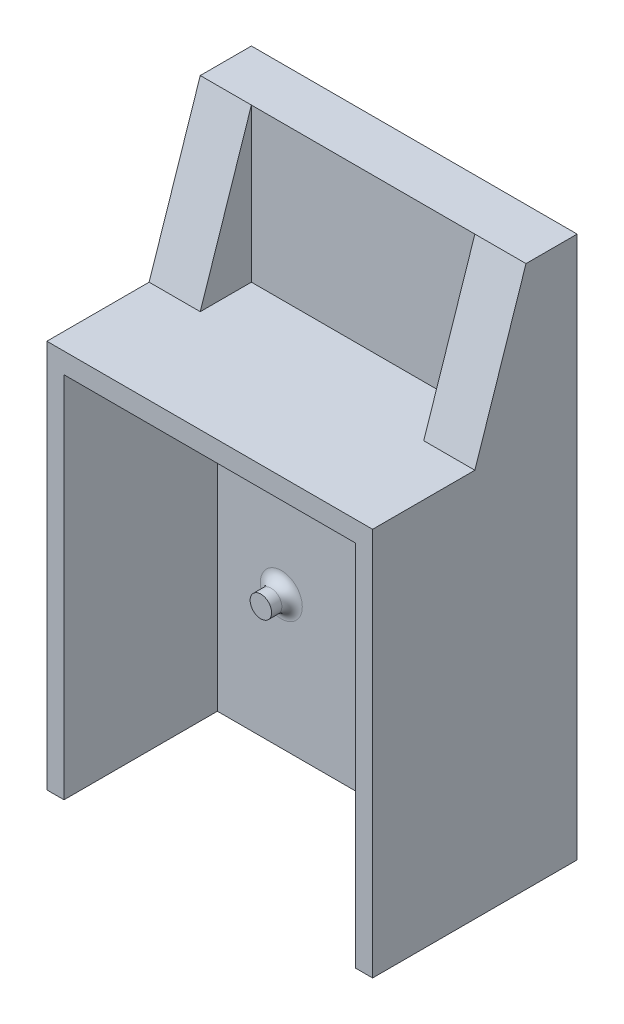
ISO-10303-21;
HEADER;
FILE_DESCRIPTION(('STEP AP214'),'2;1');
FILE_NAME('part.step','',(''),(''),'','','');
FILE_SCHEMA(('AUTOMOTIVE_DESIGN { 1 0 10303 214 1 1 1 1 }'));
ENDSEC;
DATA;
#1=APPLICATION_CONTEXT('core data for automotive mechanical design processes');
#2=APPLICATION_PROTOCOL_DEFINITION('international standard','automotive_design',2000,#1);
#3=PRODUCT_CONTEXT('',#1,'mechanical');
#4=PRODUCT('Part','Part','',(#3));
#5=PRODUCT_RELATED_PRODUCT_CATEGORY('part','',(#4));
#6=PRODUCT_DEFINITION_FORMATION('','',#4);
#7=PRODUCT_DEFINITION_CONTEXT('part definition',#1,'design');
#8=PRODUCT_DEFINITION('design','',#6,#7);
#9=PRODUCT_DEFINITION_SHAPE('','',#8);
#10=(LENGTH_UNIT() NAMED_UNIT(*) SI_UNIT(.MILLI.,.METRE.));
#11=(NAMED_UNIT(*) PLANE_ANGLE_UNIT() SI_UNIT($,.RADIAN.));
#12=(NAMED_UNIT(*) SI_UNIT($,.STERADIAN.) SOLID_ANGLE_UNIT());
#13=UNCERTAINTY_MEASURE_WITH_UNIT(LENGTH_MEASURE(1.E-05),#10,'distance_accuracy_value','');
#14=(GEOMETRIC_REPRESENTATION_CONTEXT(3) GLOBAL_UNCERTAINTY_ASSIGNED_CONTEXT((#13)) GLOBAL_UNIT_ASSIGNED_CONTEXT((#10,
#11,#12)) REPRESENTATION_CONTEXT('',''));
#15=CARTESIAN_POINT('',(0.,0.,0.));
#16=DIRECTION('',(0.,0.,1.));
#17=DIRECTION('',(1.,0.,0.));
#18=AXIS2_PLACEMENT_3D('',#15,#16,#17);
#19=CARTESIAN_POINT('',(0.,0.,5.));
#20=DIRECTION('',(0.,0.,-1.));
#21=DIRECTION('',(-1.,0.,0.));
#22=AXIS2_PLACEMENT_3D('',#19,#20,#21);
#23=PLANE('',#22);
#24=DIRECTION('',(0.,1.,0.));
#25=VECTOR('',#24,1.);
#26=CARTESIAN_POINT('',(10.9264705882353,19.,5.));
#27=LINE('',#26,#25);
#28=CARTESIAN_POINT('',(10.9264705882353,19.,5.));
#29=VERTEX_POINT('',#28);
#30=CARTESIAN_POINT('',(10.9264705882353,34.,5.));
#31=VERTEX_POINT('',#30);
#32=EDGE_CURVE('E151',#29,#31,#27,.T.);
#33=ORIENTED_EDGE('',*,*,#32,.T.);
#34=DIRECTION('',(-1.,0.,0.));
#35=VECTOR('',#34,1.);
#36=CARTESIAN_POINT('',(0.,34.,5.));
#37=LINE('',#36,#35);
#38=CARTESIAN_POINT('',(-10.9264705882353,34.,5.));
#39=VERTEX_POINT('',#38);
#40=EDGE_CURVE('E134',#31,#39,#37,.T.);
#41=ORIENTED_EDGE('',*,*,#40,.T.);
#42=DIRECTION('',(0.,-1.,0.));
#43=VECTOR('',#42,1.);
#44=CARTESIAN_POINT('',(-10.9264705882353,19.,5.));
#45=LINE('',#44,#43);
#46=CARTESIAN_POINT('',(-10.9264705882353,19.,5.));
#47=VERTEX_POINT('',#46);
#48=EDGE_CURVE('E169',#39,#47,#45,.T.);
#49=ORIENTED_EDGE('',*,*,#48,.T.);
#50=DIRECTION('',(1.,0.,0.));
#51=VECTOR('',#50,1.);
#52=CARTESIAN_POINT('',(0.,19.,5.));
#53=LINE('',#52,#51);
#54=EDGE_CURVE('E148',#47,#29,#53,.T.);
#55=ORIENTED_EDGE('',*,*,#54,.T.);
#56=EDGE_LOOP('',(#33,#41,#49,#55));
#57=FACE_BOUND('',#56,.T.);
#58=ADVANCED_FACE('F40',(#57),#23,.F.);
#59=CARTESIAN_POINT('',(0.,0.,5.));
#60=DIRECTION('',(0.,0.,1.));
#61=DIRECTION('',(1.,0.,0.));
#62=AXIS2_PLACEMENT_3D('',#59,#60,#61);
#63=PLANE('',#62);
#64=CARTESIAN_POINT('',(8.,-6.,5.));
#65=DIRECTION('',(0.,0.,1.));
#66=DIRECTION('',(1.,0.,0.));
#67=AXIS2_PLACEMENT_3D('',#64,#65,#66);
#68=CIRCLE('',#67,2.05);
#69=CARTESIAN_POINT('',(10.05,-6.,5.));
#70=VERTEX_POINT('',#69);
#71=EDGE_CURVE('E271',#70,#70,#68,.F.);
#72=ORIENTED_EDGE('',*,*,#71,.T.);
#73=EDGE_LOOP('',(#72));
#74=FACE_BOUND('',#73,.T.);
#75=CARTESIAN_POINT('',(8.,6.,5.));
#76=DIRECTION('',(0.,0.,1.));
#77=DIRECTION('',(1.,0.,0.));
#78=AXIS2_PLACEMENT_3D('',#75,#76,#77);
#79=CIRCLE('',#78,2.05);
#80=CARTESIAN_POINT('',(10.05,6.,5.));
#81=VERTEX_POINT('',#80);
#82=EDGE_CURVE('E268',#81,#81,#79,.F.);
#83=ORIENTED_EDGE('',*,*,#82,.T.);
#84=EDGE_LOOP('',(#83));
#85=FACE_BOUND('',#84,.T.);
#86=CARTESIAN_POINT('',(-8.,6.,5.));
#87=DIRECTION('',(0.,0.,1.));
#88=DIRECTION('',(1.,0.,0.));
#89=AXIS2_PLACEMENT_3D('',#86,#87,#88);
#90=CIRCLE('',#89,2.05);
#91=CARTESIAN_POINT('',(-5.95,6.,5.));
#92=VERTEX_POINT('',#91);
#93=EDGE_CURVE('E265',#92,#92,#90,.F.);
#94=ORIENTED_EDGE('',*,*,#93,.T.);
#95=EDGE_LOOP('',(#94));
#96=FACE_BOUND('',#95,.T.);
#97=CARTESIAN_POINT('',(-8.,-6.,5.));
#98=DIRECTION('',(0.,0.,1.));
#99=DIRECTION('',(1.,0.,0.));
#100=AXIS2_PLACEMENT_3D('',#97,#98,#99);
#101=CIRCLE('',#100,2.05);
#102=CARTESIAN_POINT('',(-5.95,-6.,5.));
#103=VERTEX_POINT('',#102);
#104=EDGE_CURVE('E262',#103,#103,#101,.F.);
#105=ORIENTED_EDGE('',*,*,#104,.T.);
#106=EDGE_LOOP('',(#105));
#107=FACE_BOUND('',#106,.T.);
#108=DIRECTION('',(1.,0.,0.));
#109=VECTOR('',#108,1.);
#110=CARTESIAN_POINT('',(0.,-19.,5.));
#111=LINE('',#110,#109);
#112=CARTESIAN_POINT('',(-14.25,-19.,5.));
#113=VERTEX_POINT('',#112);
#114=CARTESIAN_POINT('',(14.25,-19.,5.));
#115=VERTEX_POINT('',#114);
#116=EDGE_CURVE('E240',#113,#115,#111,.T.);
#117=ORIENTED_EDGE('',*,*,#116,.T.);
#118=DIRECTION('',(0.,1.,0.));
#119=VECTOR('',#118,1.);
#120=CARTESIAN_POINT('',(14.25,0.,5.));
#121=LINE('',#120,#119);
#122=CARTESIAN_POINT('',(14.25,17.,5.));
#123=VERTEX_POINT('',#122);
#124=EDGE_CURVE('E201',#115,#123,#121,.T.);
#125=ORIENTED_EDGE('',*,*,#124,.T.);
#126=DIRECTION('',(1.,0.,0.));
#127=VECTOR('',#126,1.);
#128=CARTESIAN_POINT('',(0.,17.,5.));
#129=LINE('',#128,#127);
#130=CARTESIAN_POINT('',(-14.25,17.,5.));
#131=VERTEX_POINT('',#130);
#132=EDGE_CURVE('E206',#131,#123,#129,.T.);
#133=ORIENTED_EDGE('',*,*,#132,.F.);
#134=DIRECTION('',(0.,-1.,0.));
#135=VECTOR('',#134,1.);
#136=CARTESIAN_POINT('',(-14.25,0.,5.));
#137=LINE('',#136,#135);
#138=EDGE_CURVE('E227',#131,#113,#137,.T.);
#139=ORIENTED_EDGE('',*,*,#138,.T.);
#140=EDGE_LOOP('',(#117,#125,#133,#139));
#141=FACE_BOUND('',#140,.T.);
#142=ADVANCED_FACE('F296',(#74,#85,#96,#107,#141),#63,.T.);
#143=CARTESIAN_POINT('',(0.,-19.,5.));
#144=DIRECTION('',(0.,1.,0.));
#145=DIRECTION('',(-1.,0.,0.));
#146=AXIS2_PLACEMENT_3D('',#143,#144,#145);
#147=PLANE('',#146);
#148=DIRECTION('',(1.,0.,0.));
#149=VECTOR('',#148,1.);
#150=CARTESIAN_POINT('',(0.,-19.,0.));
#151=LINE('',#150,#149);
#152=CARTESIAN_POINT('',(-15.9264705882353,-19.,0.));
#153=VERTEX_POINT('',#152);
#154=CARTESIAN_POINT('',(15.9264705882353,-19.,0.));
#155=VERTEX_POINT('',#154);
#156=EDGE_CURVE('E239',#153,#155,#151,.T.);
#157=ORIENTED_EDGE('',*,*,#156,.T.);
#158=DIRECTION('',(0.,0.,-1.));
#159=VECTOR('',#158,1.);
#160=CARTESIAN_POINT('',(15.9264705882353,-19.,5.));
#161=LINE('',#160,#159);
#162=CARTESIAN_POINT('',(15.9264705882353,-19.,20.));
#163=VERTEX_POINT('',#162);
#164=EDGE_CURVE('E256',#163,#155,#161,.T.);
#165=ORIENTED_EDGE('',*,*,#164,.F.);
#166=DIRECTION('',(1.,0.,0.));
#167=VECTOR('',#166,1.);
#168=CARTESIAN_POINT('',(0.,-19.,20.));
#169=LINE('',#168,#167);
#170=CARTESIAN_POINT('',(14.25,-19.,20.));
#171=VERTEX_POINT('',#170);
#172=EDGE_CURVE('E205',#171,#163,#169,.T.);
#173=ORIENTED_EDGE('',*,*,#172,.F.);
#174=DIRECTION('',(0.,0.,-1.));
#175=VECTOR('',#174,1.);
#176=CARTESIAN_POINT('',(14.25,-19.,20.));
#177=LINE('',#176,#175);
#178=EDGE_CURVE('E237',#171,#115,#177,.T.);
#179=ORIENTED_EDGE('',*,*,#178,.T.);
#180=ORIENTED_EDGE('',*,*,#116,.F.);
#181=DIRECTION('',(0.,0.,-1.));
#182=VECTOR('',#181,1.);
#183=CARTESIAN_POINT('',(-14.25,-19.,20.));
#184=LINE('',#183,#182);
#185=CARTESIAN_POINT('',(-14.25,-19.,20.));
#186=VERTEX_POINT('',#185);
#187=EDGE_CURVE('E235',#186,#113,#184,.T.);
#188=ORIENTED_EDGE('',*,*,#187,.F.);
#189=CARTESIAN_POINT('',(-15.9264705882353,-19.,20.));
#190=VERTEX_POINT('',#189);
#191=EDGE_CURVE('E210',#190,#186,#169,.T.);
#192=ORIENTED_EDGE('',*,*,#191,.F.);
#193=DIRECTION('',(0.,0.,-1.));
#194=VECTOR('',#193,1.);
#195=CARTESIAN_POINT('',(-15.9264705882353,-19.,5.));
#196=LINE('',#195,#194);
#197=EDGE_CURVE('E243',#190,#153,#196,.T.);
#198=ORIENTED_EDGE('',*,*,#197,.T.);
#199=EDGE_LOOP('',(#157,#165,#173,#179,#180,#188,#192,#198));
#200=FACE_BOUND('',#199,.T.);
#201=ADVANCED_FACE('F301',(#200),#147,.F.);
#202=CARTESIAN_POINT('',(15.9264705882353,0.,5.));
#203=DIRECTION('',(-1.,0.,0.));
#204=DIRECTION('',(0.,0.,1.));
#205=AXIS2_PLACEMENT_3D('',#202,#203,#204);
#206=PLANE('',#205);
#207=DIRECTION('',(0.,0.,-1.));
#208=VECTOR('',#207,1.);
#209=CARTESIAN_POINT('',(15.9264705882353,34.,5.));
#210=LINE('',#209,#208);
#211=CARTESIAN_POINT('',(15.9264705882353,34.,5.));
#212=VERTEX_POINT('',#211);
#213=CARTESIAN_POINT('',(15.9264705882353,34.,0.));
#214=VERTEX_POINT('',#213);
#215=EDGE_CURVE('E185',#212,#214,#210,.T.);
#216=ORIENTED_EDGE('',*,*,#215,.F.);
#217=DIRECTION('',(0.,-0.948683298050514,0.316227766016838));
#218=VECTOR('',#217,1.);
#219=CARTESIAN_POINT('',(15.9264705882353,34.,5.));
#220=LINE('',#219,#218);
#221=CARTESIAN_POINT('',(15.9264705882353,19.,10.));
#222=VERTEX_POINT('',#221);
#223=EDGE_CURVE('E160',#212,#222,#220,.T.);
#224=ORIENTED_EDGE('',*,*,#223,.T.);
#225=DIRECTION('',(0.,0.,-1.));
#226=VECTOR('',#225,1.);
#227=CARTESIAN_POINT('',(15.9264705882353,19.,5.));
#228=LINE('',#227,#226);
#229=CARTESIAN_POINT('',(15.9264705882353,19.,20.));
#230=VERTEX_POINT('',#229);
#231=EDGE_CURVE('E254',#230,#222,#228,.T.);
#232=ORIENTED_EDGE('',*,*,#231,.F.);
#233=DIRECTION('',(0.,1.,0.));
#234=VECTOR('',#233,1.);
#235=CARTESIAN_POINT('',(15.9264705882353,0.,20.));
#236=LINE('',#235,#234);
#237=EDGE_CURVE('E209',#163,#230,#236,.T.);
#238=ORIENTED_EDGE('',*,*,#237,.F.);
#239=ORIENTED_EDGE('',*,*,#164,.T.);
#240=DIRECTION('',(0.,1.,0.));
#241=VECTOR('',#240,1.);
#242=CARTESIAN_POINT('',(15.9264705882353,0.,0.));
#243=LINE('',#242,#241);
#244=EDGE_CURVE('E247',#155,#214,#243,.T.);
#245=ORIENTED_EDGE('',*,*,#244,.T.);
#246=EDGE_LOOP('',(#216,#224,#232,#238,#239,#245));
#247=FACE_BOUND('',#246,.T.);
#248=ADVANCED_FACE('F367',(#247),#206,.F.);
#249=CARTESIAN_POINT('',(0.,19.,5.));
#250=DIRECTION('',(0.,1.,0.));
#251=DIRECTION('',(-1.,0.,0.));
#252=AXIS2_PLACEMENT_3D('',#249,#250,#251);
#253=PLANE('',#252);
#254=DIRECTION('',(1.,0.,0.));
#255=VECTOR('',#254,1.);
#256=CARTESIAN_POINT('',(10.9264705882353,19.,10.));
#257=LINE('',#256,#255);
#258=CARTESIAN_POINT('',(10.9264705882353,19.,10.));
#259=VERTEX_POINT('',#258);
#260=EDGE_CURVE('E55',#259,#222,#257,.T.);
#261=ORIENTED_EDGE('',*,*,#260,.F.);
#262=DIRECTION('',(0.,0.,-1.));
#263=VECTOR('',#262,1.);
#264=CARTESIAN_POINT('',(10.9264705882353,19.,10.));
#265=LINE('',#264,#263);
#266=EDGE_CURVE('E59',#259,#29,#265,.T.);
#267=ORIENTED_EDGE('',*,*,#266,.T.);
#268=ORIENTED_EDGE('',*,*,#54,.F.);
#269=DIRECTION('',(0.,0.,1.));
#270=VECTOR('',#269,1.);
#271=CARTESIAN_POINT('',(-10.9264705882353,19.,10.));
#272=LINE('',#271,#270);
#273=CARTESIAN_POINT('',(-10.9264705882353,19.,10.));
#274=VERTEX_POINT('',#273);
#275=EDGE_CURVE('E171',#47,#274,#272,.T.);
#276=ORIENTED_EDGE('',*,*,#275,.T.);
#277=DIRECTION('',(-1.,0.,0.));
#278=VECTOR('',#277,1.);
#279=CARTESIAN_POINT('',(-10.9264705882353,19.,10.));
#280=LINE('',#279,#278);
#281=CARTESIAN_POINT('',(-15.9264705882353,19.,10.));
#282=VERTEX_POINT('',#281);
#283=EDGE_CURVE('E177',#274,#282,#280,.T.);
#284=ORIENTED_EDGE('',*,*,#283,.T.);
#285=DIRECTION('',(0.,0.,-1.));
#286=VECTOR('',#285,1.);
#287=CARTESIAN_POINT('',(-15.9264705882353,19.,5.));
#288=LINE('',#287,#286);
#289=CARTESIAN_POINT('',(-15.9264705882353,19.,20.));
#290=VERTEX_POINT('',#289);
#291=EDGE_CURVE('E251',#290,#282,#288,.T.);
#292=ORIENTED_EDGE('',*,*,#291,.F.);
#293=DIRECTION('',(-1.,0.,0.));
#294=VECTOR('',#293,1.);
#295=CARTESIAN_POINT('',(0.,19.,20.));
#296=LINE('',#295,#294);
#297=EDGE_CURVE('E213',#230,#290,#296,.T.);
#298=ORIENTED_EDGE('',*,*,#297,.F.);
#299=ORIENTED_EDGE('',*,*,#231,.T.);
#300=EDGE_LOOP('',(#261,#267,#268,#276,#284,#292,#298,#299));
#301=FACE_BOUND('',#300,.T.);
#302=ADVANCED_FACE('F363',(#301),#253,.T.);
#303=CARTESIAN_POINT('',(-15.9264705882353,0.,5.));
#304=DIRECTION('',(-1.,0.,0.));
#305=DIRECTION('',(0.,-1.,0.));
#306=AXIS2_PLACEMENT_3D('',#303,#304,#305);
#307=PLANE('',#306);
#308=ORIENTED_EDGE('',*,*,#291,.T.);
#309=DIRECTION('',(0.,0.948683298050514,-0.316227766016838));
#310=VECTOR('',#309,1.);
#311=CARTESIAN_POINT('',(-15.9264705882353,34.,5.));
#312=LINE('',#311,#310);
#313=CARTESIAN_POINT('',(-15.9264705882353,34.,5.));
#314=VERTEX_POINT('',#313);
#315=EDGE_CURVE('E164',#282,#314,#312,.T.);
#316=ORIENTED_EDGE('',*,*,#315,.T.);
#317=DIRECTION('',(0.,0.,-1.));
#318=VECTOR('',#317,1.);
#319=CARTESIAN_POINT('',(-15.9264705882353,34.,5.));
#320=LINE('',#319,#318);
#321=CARTESIAN_POINT('',(-15.9264705882353,34.,0.));
#322=VERTEX_POINT('',#321);
#323=EDGE_CURVE('E161',#314,#322,#320,.T.);
#324=ORIENTED_EDGE('',*,*,#323,.T.);
#325=DIRECTION('',(0.,1.,0.));
#326=VECTOR('',#325,1.);
#327=CARTESIAN_POINT('',(-15.9264705882353,0.,0.));
#328=LINE('',#327,#326);
#329=EDGE_CURVE('E244',#153,#322,#328,.T.);
#330=ORIENTED_EDGE('',*,*,#329,.F.);
#331=ORIENTED_EDGE('',*,*,#197,.F.);
#332=DIRECTION('',(0.,-1.,0.));
#333=VECTOR('',#332,1.);
#334=CARTESIAN_POINT('',(-15.9264705882353,0.,20.));
#335=LINE('',#334,#333);
#336=EDGE_CURVE('E216',#290,#190,#335,.T.);
#337=ORIENTED_EDGE('',*,*,#336,.F.);
#338=EDGE_LOOP('',(#308,#316,#324,#330,#331,#337));
#339=FACE_BOUND('',#338,.T.);
#340=ADVANCED_FACE('F359',(#339),#307,.T.);
#341=CARTESIAN_POINT('',(0.,0.,0.));
#342=DIRECTION('',(0.,0.,1.));
#343=DIRECTION('',(1.,0.,0.));
#344=AXIS2_PLACEMENT_3D('',#341,#342,#343);
#345=PLANE('',#344);
#346=ORIENTED_EDGE('',*,*,#156,.F.);
#347=ORIENTED_EDGE('',*,*,#329,.T.);
#348=DIRECTION('',(-1.,0.,0.));
#349=VECTOR('',#348,1.);
#350=CARTESIAN_POINT('',(0.,34.,0.));
#351=LINE('',#350,#349);
#352=EDGE_CURVE('E180',#214,#322,#351,.T.);
#353=ORIENTED_EDGE('',*,*,#352,.F.);
#354=ORIENTED_EDGE('',*,*,#244,.F.);
#355=EDGE_LOOP('',(#346,#347,#353,#354));
#356=FACE_BOUND('',#355,.T.);
#357=ADVANCED_FACE('F354',(#356),#345,.F.);
#358=CARTESIAN_POINT('',(14.25,0.,20.));
#359=DIRECTION('',(-1.,0.,0.));
#360=DIRECTION('',(0.,0.,1.));
#361=AXIS2_PLACEMENT_3D('',#358,#359,#360);
#362=PLANE('',#361);
#363=ORIENTED_EDGE('',*,*,#124,.F.);
#364=ORIENTED_EDGE('',*,*,#178,.F.);
#365=DIRECTION('',(0.,1.,0.));
#366=VECTOR('',#365,1.);
#367=CARTESIAN_POINT('',(14.25,0.,20.));
#368=LINE('',#367,#366);
#369=CARTESIAN_POINT('',(14.25,17.,20.));
#370=VERTEX_POINT('',#369);
#371=EDGE_CURVE('E202',#171,#370,#368,.T.);
#372=ORIENTED_EDGE('',*,*,#371,.T.);
#373=DIRECTION('',(0.,0.,-1.));
#374=VECTOR('',#373,1.);
#375=CARTESIAN_POINT('',(14.25,17.,20.));
#376=LINE('',#375,#374);
#377=EDGE_CURVE('E224',#370,#123,#376,.T.);
#378=ORIENTED_EDGE('',*,*,#377,.T.);
#379=EDGE_LOOP('',(#363,#364,#372,#378));
#380=FACE_BOUND('',#379,.T.);
#381=ADVANCED_FACE('F351',(#380),#362,.T.);
#382=CARTESIAN_POINT('',(-14.25,0.,20.));
#383=DIRECTION('',(1.,0.,0.));
#384=DIRECTION('',(0.,0.,-1.));
#385=AXIS2_PLACEMENT_3D('',#382,#383,#384);
#386=PLANE('',#385);
#387=ORIENTED_EDGE('',*,*,#138,.F.);
#388=DIRECTION('',(0.,0.,-1.));
#389=VECTOR('',#388,1.);
#390=CARTESIAN_POINT('',(-14.25,17.,20.));
#391=LINE('',#390,#389);
#392=CARTESIAN_POINT('',(-14.25,17.,20.));
#393=VERTEX_POINT('',#392);
#394=EDGE_CURVE('E233',#393,#131,#391,.T.);
#395=ORIENTED_EDGE('',*,*,#394,.F.);
#396=DIRECTION('',(0.,-1.,0.));
#397=VECTOR('',#396,1.);
#398=CARTESIAN_POINT('',(-14.25,0.,20.));
#399=LINE('',#398,#397);
#400=EDGE_CURVE('E219',#393,#186,#399,.T.);
#401=ORIENTED_EDGE('',*,*,#400,.T.);
#402=ORIENTED_EDGE('',*,*,#187,.T.);
#403=EDGE_LOOP('',(#387,#395,#401,#402));
#404=FACE_BOUND('',#403,.T.);
#405=ADVANCED_FACE('F347',(#404),#386,.T.);
#406=CARTESIAN_POINT('',(0.,17.,20.));
#407=DIRECTION('',(0.,1.,0.));
#408=DIRECTION('',(0.,0.,1.));
#409=AXIS2_PLACEMENT_3D('',#406,#407,#408);
#410=PLANE('',#409);
#411=ORIENTED_EDGE('',*,*,#132,.T.);
#412=ORIENTED_EDGE('',*,*,#377,.F.);
#413=DIRECTION('',(1.,0.,0.));
#414=VECTOR('',#413,1.);
#415=CARTESIAN_POINT('',(0.,17.,20.));
#416=LINE('',#415,#414);
#417=EDGE_CURVE('E222',#393,#370,#416,.T.);
#418=ORIENTED_EDGE('',*,*,#417,.F.);
#419=ORIENTED_EDGE('',*,*,#394,.T.);
#420=EDGE_LOOP('',(#411,#412,#418,#419));
#421=FACE_BOUND('',#420,.T.);
#422=ADVANCED_FACE('F343',(#421),#410,.F.);
#423=CARTESIAN_POINT('',(0.,0.,20.));
#424=DIRECTION('',(0.,0.,1.));
#425=DIRECTION('',(1.,0.,0.));
#426=AXIS2_PLACEMENT_3D('',#423,#424,#425);
#427=PLANE('',#426);
#428=ORIENTED_EDGE('',*,*,#371,.F.);
#429=ORIENTED_EDGE('',*,*,#172,.T.);
#430=ORIENTED_EDGE('',*,*,#237,.T.);
#431=ORIENTED_EDGE('',*,*,#297,.T.);
#432=ORIENTED_EDGE('',*,*,#336,.T.);
#433=ORIENTED_EDGE('',*,*,#191,.T.);
#434=ORIENTED_EDGE('',*,*,#400,.F.);
#435=ORIENTED_EDGE('',*,*,#417,.T.);
#436=EDGE_LOOP('',(#428,#429,#430,#431,#432,#433,#434,#435));
#437=FACE_BOUND('',#436,.T.);
#438=ADVANCED_FACE('F340',(#437),#427,.T.);
#439=CARTESIAN_POINT('',(-8.,6.,7.));
#440=DIRECTION('',(0.,0.,-1.));
#441=DIRECTION('',(-1.,0.,0.));
#442=AXIS2_PLACEMENT_3D('',#439,#440,#441);
#443=CYLINDRICAL_SURFACE('',#442,1.05);
#444=CARTESIAN_POINT('',(-8.,6.,6.));
#445=DIRECTION('',(0.,0.,1.));
#446=DIRECTION('',(1.,0.,0.));
#447=AXIS2_PLACEMENT_3D('',#444,#445,#446);
#448=CIRCLE('',#447,1.05);
#449=CARTESIAN_POINT('',(-6.95,6.,6.));
#450=VERTEX_POINT('',#449);
#451=EDGE_CURVE('E48',#450,#450,#448,.T.);
#452=ORIENTED_EDGE('',*,*,#451,.T.);
#453=EDGE_LOOP('',(#452));
#454=FACE_BOUND('',#453,.T.);
#455=CARTESIAN_POINT('',(-8.,6.,7.));
#456=DIRECTION('',(0.,0.,1.));
#457=DIRECTION('',(1.,0.,0.));
#458=AXIS2_PLACEMENT_3D('',#455,#456,#457);
#459=CIRCLE('',#458,1.05);
#460=CARTESIAN_POINT('',(-6.95,6.,7.));
#461=VERTEX_POINT('',#460);
#462=EDGE_CURVE('E198',#461,#461,#459,.T.);
#463=ORIENTED_EDGE('',*,*,#462,.F.);
#464=EDGE_LOOP('',(#463));
#465=FACE_BOUND('',#464,.T.);
#466=ADVANCED_FACE('F279',(#454,#465),#443,.T.);
#467=CARTESIAN_POINT('',(0.,0.,7.));
#468=DIRECTION('',(0.,0.,1.));
#469=DIRECTION('',(1.,0.,0.));
#470=AXIS2_PLACEMENT_3D('',#467,#468,#469);
#471=PLANE('',#470);
#472=ORIENTED_EDGE('',*,*,#462,.T.);
#473=EDGE_LOOP('',(#472));
#474=FACE_BOUND('',#473,.T.);
#475=ADVANCED_FACE('F333',(#474),#471,.T.);
#476=CARTESIAN_POINT('',(8.,6.,7.));
#477=DIRECTION('',(0.,0.,-1.));
#478=DIRECTION('',(-1.,0.,0.));
#479=AXIS2_PLACEMENT_3D('',#476,#477,#478);
#480=CYLINDRICAL_SURFACE('',#479,1.05);
#481=CARTESIAN_POINT('',(8.,6.,6.));
#482=DIRECTION('',(0.,0.,1.));
#483=DIRECTION('',(1.,0.,0.));
#484=AXIS2_PLACEMENT_3D('',#481,#482,#483);
#485=CIRCLE('',#484,1.05);
#486=CARTESIAN_POINT('',(9.05,6.,6.));
#487=VERTEX_POINT('',#486);
#488=EDGE_CURVE('E274',#487,#487,#485,.T.);
#489=ORIENTED_EDGE('',*,*,#488,.T.);
#490=EDGE_LOOP('',(#489));
#491=FACE_BOUND('',#490,.T.);
#492=CARTESIAN_POINT('',(8.,6.,7.));
#493=DIRECTION('',(0.,0.,1.));
#494=DIRECTION('',(1.,0.,0.));
#495=AXIS2_PLACEMENT_3D('',#492,#493,#494);
#496=CIRCLE('',#495,1.05);
#497=CARTESIAN_POINT('',(9.05,6.,7.));
#498=VERTEX_POINT('',#497);
#499=EDGE_CURVE('E195',#498,#498,#496,.F.);
#500=ORIENTED_EDGE('',*,*,#499,.T.);
#501=EDGE_LOOP('',(#500));
#502=FACE_BOUND('',#501,.T.);
#503=ADVANCED_FACE('F329',(#491,#502),#480,.T.);
#504=CARTESIAN_POINT('',(0.,0.,7.));
#505=DIRECTION('',(0.,0.,1.));
#506=DIRECTION('',(1.,0.,0.));
#507=AXIS2_PLACEMENT_3D('',#504,#505,#506);
#508=PLANE('',#507);
#509=ORIENTED_EDGE('',*,*,#499,.F.);
#510=EDGE_LOOP('',(#509));
#511=FACE_BOUND('',#510,.T.);
#512=ADVANCED_FACE('F325',(#511),#508,.T.);
#513=CARTESIAN_POINT('',(-8.,-6.,7.));
#514=DIRECTION('',(0.,0.,-1.));
#515=DIRECTION('',(-1.,0.,0.));
#516=AXIS2_PLACEMENT_3D('',#513,#514,#515);
#517=CYLINDRICAL_SURFACE('',#516,1.05);
#518=CARTESIAN_POINT('',(-8.,-6.,6.));
#519=DIRECTION('',(0.,0.,1.));
#520=DIRECTION('',(1.,0.,0.));
#521=AXIS2_PLACEMENT_3D('',#518,#519,#520);
#522=CIRCLE('',#521,1.05);
#523=CARTESIAN_POINT('',(-6.95,-6.,6.));
#524=VERTEX_POINT('',#523);
#525=EDGE_CURVE('E11',#524,#524,#522,.T.);
#526=ORIENTED_EDGE('',*,*,#525,.T.);
#527=EDGE_LOOP('',(#526));
#528=FACE_BOUND('',#527,.T.);
#529=CARTESIAN_POINT('',(-8.,-6.,7.));
#530=DIRECTION('',(0.,0.,1.));
#531=DIRECTION('',(1.,0.,0.));
#532=AXIS2_PLACEMENT_3D('',#529,#530,#531);
#533=CIRCLE('',#532,1.05);
#534=CARTESIAN_POINT('',(-6.95,-6.,7.));
#535=VERTEX_POINT('',#534);
#536=EDGE_CURVE('E192',#535,#535,#533,.F.);
#537=ORIENTED_EDGE('',*,*,#536,.T.);
#538=EDGE_LOOP('',(#537));
#539=FACE_BOUND('',#538,.T.);
#540=ADVANCED_FACE('F321',(#528,#539),#517,.T.);
#541=CARTESIAN_POINT('',(0.,0.,7.));
#542=DIRECTION('',(0.,0.,1.));
#543=DIRECTION('',(1.,0.,0.));
#544=AXIS2_PLACEMENT_3D('',#541,#542,#543);
#545=PLANE('',#544);
#546=ORIENTED_EDGE('',*,*,#536,.F.);
#547=EDGE_LOOP('',(#546));
#548=FACE_BOUND('',#547,.T.);
#549=ADVANCED_FACE('F317',(#548),#545,.T.);
#550=CARTESIAN_POINT('',(8.,-6.,7.));
#551=DIRECTION('',(0.,0.,-1.));
#552=DIRECTION('',(-1.,0.,0.));
#553=AXIS2_PLACEMENT_3D('',#550,#551,#552);
#554=CYLINDRICAL_SURFACE('',#553,1.05);
#555=CARTESIAN_POINT('',(8.,-6.,6.));
#556=DIRECTION('',(0.,0.,1.));
#557=DIRECTION('',(1.,0.,0.));
#558=AXIS2_PLACEMENT_3D('',#555,#556,#557);
#559=CIRCLE('',#558,1.05);
#560=CARTESIAN_POINT('',(9.05,-6.,6.));
#561=VERTEX_POINT('',#560);
#562=EDGE_CURVE('E259',#561,#561,#559,.T.);
#563=ORIENTED_EDGE('',*,*,#562,.T.);
#564=EDGE_LOOP('',(#563));
#565=FACE_BOUND('',#564,.T.);
#566=CARTESIAN_POINT('',(8.,-6.,7.));
#567=DIRECTION('',(0.,0.,1.));
#568=DIRECTION('',(1.,0.,0.));
#569=AXIS2_PLACEMENT_3D('',#566,#567,#568);
#570=CIRCLE('',#569,1.05);
#571=CARTESIAN_POINT('',(9.05,-6.,7.));
#572=VERTEX_POINT('',#571);
#573=EDGE_CURVE('E187',#572,#572,#570,.T.);
#574=ORIENTED_EDGE('',*,*,#573,.F.);
#575=EDGE_LOOP('',(#574));
#576=FACE_BOUND('',#575,.T.);
#577=ADVANCED_FACE('F313',(#565,#576),#554,.T.);
#578=CARTESIAN_POINT('',(0.,0.,7.));
#579=DIRECTION('',(0.,0.,1.));
#580=DIRECTION('',(1.,0.,0.));
#581=AXIS2_PLACEMENT_3D('',#578,#579,#580);
#582=PLANE('',#581);
#583=ORIENTED_EDGE('',*,*,#573,.T.);
#584=EDGE_LOOP('',(#583));
#585=FACE_BOUND('',#584,.T.);
#586=ADVANCED_FACE('F310',(#585),#582,.T.);
#587=CARTESIAN_POINT('',(0.,34.,5.));
#588=DIRECTION('',(0.,-1.,0.));
#589=DIRECTION('',(0.,0.,-1.));
#590=AXIS2_PLACEMENT_3D('',#587,#588,#589);
#591=PLANE('',#590);
#592=ORIENTED_EDGE('',*,*,#352,.T.);
#593=ORIENTED_EDGE('',*,*,#323,.F.);
#594=DIRECTION('',(-1.,0.,0.));
#595=VECTOR('',#594,1.);
#596=CARTESIAN_POINT('',(-10.9264705882353,34.,5.));
#597=LINE('',#596,#595);
#598=EDGE_CURVE('E144',#39,#314,#597,.T.);
#599=ORIENTED_EDGE('',*,*,#598,.F.);
#600=ORIENTED_EDGE('',*,*,#40,.F.);
#601=EDGE_CURVE('E140',#212,#31,#37,.T.);
#602=ORIENTED_EDGE('',*,*,#601,.F.);
#603=ORIENTED_EDGE('',*,*,#215,.T.);
#604=EDGE_LOOP('',(#592,#593,#599,#600,#602,#603));
#605=FACE_BOUND('',#604,.T.);
#606=ADVANCED_FACE('F137',(#605),#591,.F.);
#607=CARTESIAN_POINT('',(-10.9264705882353,34.,5.));
#608=DIRECTION('',(0.,0.316227766016838,0.948683298050514));
#609=DIRECTION('',(0.,-0.948683298050514,0.316227766016838));
#610=AXIS2_PLACEMENT_3D('',#607,#608,#609);
#611=PLANE('',#610);
#612=ORIENTED_EDGE('',*,*,#315,.F.);
#613=ORIENTED_EDGE('',*,*,#283,.F.);
#614=DIRECTION('',(0.,0.948683298050514,-0.316227766016838));
#615=VECTOR('',#614,1.);
#616=CARTESIAN_POINT('',(-10.9264705882353,34.,5.));
#617=LINE('',#616,#615);
#618=EDGE_CURVE('E174',#274,#39,#617,.T.);
#619=ORIENTED_EDGE('',*,*,#618,.T.);
#620=ORIENTED_EDGE('',*,*,#598,.T.);
#621=EDGE_LOOP('',(#612,#613,#619,#620));
#622=FACE_BOUND('',#621,.T.);
#623=ADVANCED_FACE('F306',(#622),#611,.T.);
#624=CARTESIAN_POINT('',(-10.9264705882353,0.,0.));
#625=DIRECTION('',(-1.,0.,0.));
#626=DIRECTION('',(0.,-1.,0.));
#627=AXIS2_PLACEMENT_3D('',#624,#625,#626);
#628=PLANE('',#627);
#629=ORIENTED_EDGE('',*,*,#48,.F.);
#630=ORIENTED_EDGE('',*,*,#618,.F.);
#631=ORIENTED_EDGE('',*,*,#275,.F.);
#632=EDGE_LOOP('',(#629,#630,#631));
#633=FACE_BOUND('',#632,.T.);
#634=ADVANCED_FACE('F411',(#633),#628,.F.);
#635=CARTESIAN_POINT('',(10.9264705882353,34.,5.));
#636=DIRECTION('',(0.,0.316227766016838,0.948683298050514));
#637=DIRECTION('',(0.,-0.948683298050514,0.316227766016838));
#638=AXIS2_PLACEMENT_3D('',#635,#636,#637);
#639=PLANE('',#638);
#640=ORIENTED_EDGE('',*,*,#223,.F.);
#641=ORIENTED_EDGE('',*,*,#601,.T.);
#642=DIRECTION('',(0.,-0.948683298050514,0.316227766016838));
#643=VECTOR('',#642,1.);
#644=CARTESIAN_POINT('',(10.9264705882353,34.,5.));
#645=LINE('',#644,#643);
#646=EDGE_CURVE('E154',#31,#259,#645,.T.);
#647=ORIENTED_EDGE('',*,*,#646,.T.);
#648=ORIENTED_EDGE('',*,*,#260,.T.);
#649=EDGE_LOOP('',(#640,#641,#647,#648));
#650=FACE_BOUND('',#649,.T.);
#651=ADVANCED_FACE('F158',(#650),#639,.T.);
#652=CARTESIAN_POINT('',(10.9264705882353,0.,0.));
#653=DIRECTION('',(1.,0.,0.));
#654=DIRECTION('',(0.,0.,-1.));
#655=AXIS2_PLACEMENT_3D('',#652,#653,#654);
#656=PLANE('',#655);
#657=ORIENTED_EDGE('',*,*,#266,.F.);
#658=ORIENTED_EDGE('',*,*,#646,.F.);
#659=ORIENTED_EDGE('',*,*,#32,.F.);
#660=EDGE_LOOP('',(#657,#658,#659));
#661=FACE_BOUND('',#660,.T.);
#662=ADVANCED_FACE('F162',(#661),#656,.F.);
#663=CARTESIAN_POINT('',(8.,-6.,6.));
#664=DIRECTION('',(0.,0.,1.));
#665=DIRECTION('',(1.,0.,0.));
#666=AXIS2_PLACEMENT_3D('',#663,#664,#665);
#667=TOROIDAL_SURFACE('',#666,2.05,1.);
#668=ORIENTED_EDGE('',*,*,#71,.F.);
#669=EDGE_LOOP('',(#668));
#670=FACE_BOUND('',#669,.T.);
#671=ORIENTED_EDGE('',*,*,#562,.F.);
#672=EDGE_LOOP('',(#671));
#673=FACE_BOUND('',#672,.T.);
#674=ADVANCED_FACE('F291',(#670,#673),#667,.F.);
#675=CARTESIAN_POINT('',(8.,6.,6.));
#676=DIRECTION('',(0.,0.,1.));
#677=DIRECTION('',(1.,0.,0.));
#678=AXIS2_PLACEMENT_3D('',#675,#676,#677);
#679=TOROIDAL_SURFACE('',#678,2.05,1.);
#680=ORIENTED_EDGE('',*,*,#82,.F.);
#681=EDGE_LOOP('',(#680));
#682=FACE_BOUND('',#681,.T.);
#683=ORIENTED_EDGE('',*,*,#488,.F.);
#684=EDGE_LOOP('',(#683));
#685=FACE_BOUND('',#684,.T.);
#686=ADVANCED_FACE('F284',(#682,#685),#679,.F.);
#687=CARTESIAN_POINT('',(-8.,6.,6.));
#688=DIRECTION('',(0.,0.,1.));
#689=DIRECTION('',(1.,0.,0.));
#690=AXIS2_PLACEMENT_3D('',#687,#688,#689);
#691=TOROIDAL_SURFACE('',#690,2.05,1.);
#692=ORIENTED_EDGE('',*,*,#93,.F.);
#693=EDGE_LOOP('',(#692));
#694=FACE_BOUND('',#693,.T.);
#695=ORIENTED_EDGE('',*,*,#451,.F.);
#696=EDGE_LOOP('',(#695));
#697=FACE_BOUND('',#696,.T.);
#698=ADVANCED_FACE('F282',(#694,#697),#691,.F.);
#699=CARTESIAN_POINT('',(-8.,-6.,6.));
#700=DIRECTION('',(0.,0.,1.));
#701=DIRECTION('',(1.,0.,0.));
#702=AXIS2_PLACEMENT_3D('',#699,#700,#701);
#703=TOROIDAL_SURFACE('',#702,2.05,1.);
#704=ORIENTED_EDGE('',*,*,#104,.F.);
#705=EDGE_LOOP('',(#704));
#706=FACE_BOUND('',#705,.T.);
#707=ORIENTED_EDGE('',*,*,#525,.F.);
#708=EDGE_LOOP('',(#707));
#709=FACE_BOUND('',#708,.T.);
#710=ADVANCED_FACE('F42',(#706,#709),#703,.F.);
#711=CLOSED_SHELL('',(#58,#142,#201,#248,#302,#340,#357,#381,#405,#422,#438,#466,#475,#503,#512,
#540,#549,#577,#586,#606,#623,#634,#651,#662,#674,#686,#698,#710));
#712=MANIFOLD_SOLID_BREP('B2',#711);
#713=ADVANCED_BREP_SHAPE_REPRESENTATION('',(#18,#712),#14);
#714=SHAPE_DEFINITION_REPRESENTATION(#9,#713);
ENDSEC;
END-ISO-10303-21;
